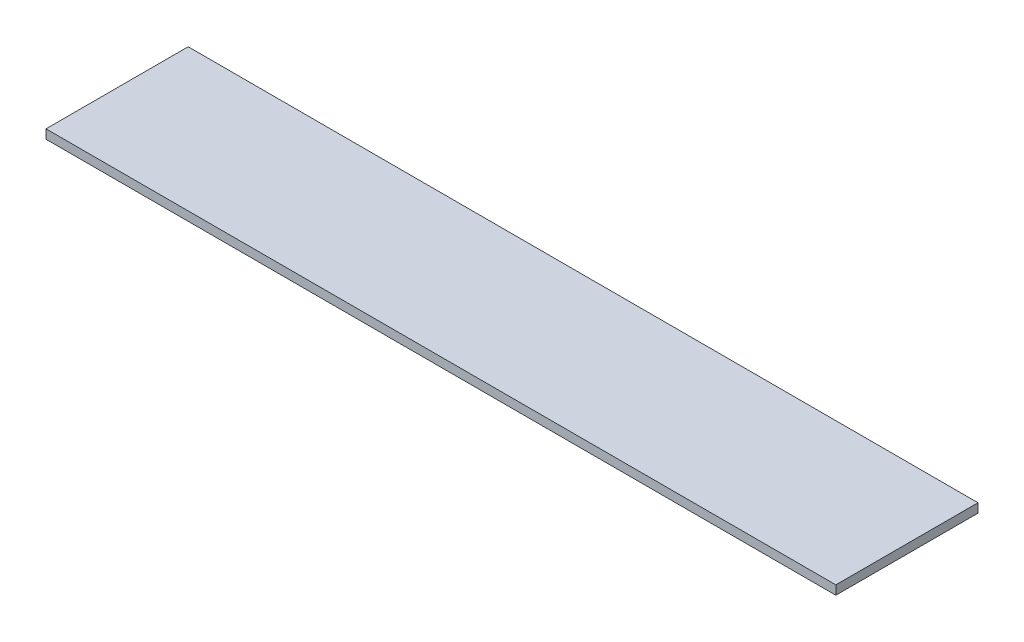
ISO-10303-21;
HEADER;
FILE_DESCRIPTION(('STEP AP214'),'2;1');
FILE_NAME('part.step','',(''),(''),'','','');
FILE_SCHEMA(('AUTOMOTIVE_DESIGN { 1 0 10303 214 1 1 1 1 }'));
ENDSEC;
DATA;
#1=APPLICATION_CONTEXT('core data for automotive mechanical design processes');
#2=APPLICATION_PROTOCOL_DEFINITION('international standard','automotive_design',2000,#1);
#3=PRODUCT_CONTEXT('',#1,'mechanical');
#4=PRODUCT('Part','Part','',(#3));
#5=PRODUCT_RELATED_PRODUCT_CATEGORY('part','',(#4));
#6=PRODUCT_DEFINITION_FORMATION('','',#4);
#7=PRODUCT_DEFINITION_CONTEXT('part definition',#1,'design');
#8=PRODUCT_DEFINITION('design','',#6,#7);
#9=PRODUCT_DEFINITION_SHAPE('','',#8);
#10=(LENGTH_UNIT() NAMED_UNIT(*) SI_UNIT(.MILLI.,.METRE.));
#11=(NAMED_UNIT(*) PLANE_ANGLE_UNIT() SI_UNIT($,.RADIAN.));
#12=(NAMED_UNIT(*) SI_UNIT($,.STERADIAN.) SOLID_ANGLE_UNIT());
#13=UNCERTAINTY_MEASURE_WITH_UNIT(LENGTH_MEASURE(1.E-05),#10,'distance_accuracy_value','');
#14=(GEOMETRIC_REPRESENTATION_CONTEXT(3) GLOBAL_UNCERTAINTY_ASSIGNED_CONTEXT((#13)) GLOBAL_UNIT_ASSIGNED_CONTEXT((#10,
#11,#12)) REPRESENTATION_CONTEXT('',''));
#15=CARTESIAN_POINT('',(0.,0.,0.));
#16=DIRECTION('',(0.,0.,1.));
#17=DIRECTION('',(1.,0.,0.));
#18=AXIS2_PLACEMENT_3D('',#15,#16,#17);
#19=CARTESIAN_POINT('',(175.,-4.,31.5));
#20=DIRECTION('',(1.,0.,0.));
#21=DIRECTION('',(0.,0.,-1.));
#22=AXIS2_PLACEMENT_3D('',#19,#20,#21);
#23=PLANE('',#22);
#24=DIRECTION('',(0.,0.,-1.));
#25=VECTOR('',#24,1.);
#26=CARTESIAN_POINT('',(175.,0.,31.5));
#27=LINE('',#26,#25);
#28=CARTESIAN_POINT('',(175.,0.,31.5));
#29=VERTEX_POINT('',#28);
#30=CARTESIAN_POINT('',(175.,0.,-31.5));
#31=VERTEX_POINT('',#30);
#32=EDGE_CURVE('E101',#29,#31,#27,.T.);
#33=ORIENTED_EDGE('',*,*,#32,.F.);
#34=DIRECTION('',(0.,1.,0.));
#35=VECTOR('',#34,1.);
#36=CARTESIAN_POINT('',(175.,-4.,31.5));
#37=LINE('',#36,#35);
#38=CARTESIAN_POINT('',(175.,-4.,31.5));
#39=VERTEX_POINT('',#38);
#40=EDGE_CURVE('E11',#39,#29,#37,.T.);
#41=ORIENTED_EDGE('',*,*,#40,.F.);
#42=DIRECTION('',(0.,0.,-1.));
#43=VECTOR('',#42,1.);
#44=CARTESIAN_POINT('',(175.,-4.,31.5));
#45=LINE('',#44,#43);
#46=CARTESIAN_POINT('',(175.,-4.,-31.5));
#47=VERTEX_POINT('',#46);
#48=EDGE_CURVE('E95',#39,#47,#45,.T.);
#49=ORIENTED_EDGE('',*,*,#48,.T.);
#50=DIRECTION('',(0.,1.,0.));
#51=VECTOR('',#50,1.);
#52=CARTESIAN_POINT('',(175.,-4.,-31.5));
#53=LINE('',#52,#51);
#54=EDGE_CURVE('E40',#47,#31,#53,.T.);
#55=ORIENTED_EDGE('',*,*,#54,.T.);
#56=EDGE_LOOP('',(#33,#41,#49,#55));
#57=FACE_BOUND('',#56,.T.);
#58=ADVANCED_FACE('F37',(#57),#23,.T.);
#59=CARTESIAN_POINT('',(-175.,-4.,31.5));
#60=DIRECTION('',(0.,0.,1.));
#61=DIRECTION('',(1.,0.,0.));
#62=AXIS2_PLACEMENT_3D('',#59,#60,#61);
#63=PLANE('',#62);
#64=DIRECTION('',(1.,0.,0.));
#65=VECTOR('',#64,1.);
#66=CARTESIAN_POINT('',(-175.,0.,31.5));
#67=LINE('',#66,#65);
#68=CARTESIAN_POINT('',(-175.,0.,31.5));
#69=VERTEX_POINT('',#68);
#70=EDGE_CURVE('E97',#69,#29,#67,.T.);
#71=ORIENTED_EDGE('',*,*,#70,.F.);
#72=DIRECTION('',(0.,1.,0.));
#73=VECTOR('',#72,1.);
#74=CARTESIAN_POINT('',(-175.,-4.,31.5));
#75=LINE('',#74,#73);
#76=CARTESIAN_POINT('',(-175.,-4.,31.5));
#77=VERTEX_POINT('',#76);
#78=EDGE_CURVE('E46',#77,#69,#75,.T.);
#79=ORIENTED_EDGE('',*,*,#78,.F.);
#80=DIRECTION('',(1.,0.,0.));
#81=VECTOR('',#80,1.);
#82=CARTESIAN_POINT('',(-175.,-4.,31.5));
#83=LINE('',#82,#81);
#84=EDGE_CURVE('E92',#77,#39,#83,.T.);
#85=ORIENTED_EDGE('',*,*,#84,.T.);
#86=ORIENTED_EDGE('',*,*,#40,.T.);
#87=EDGE_LOOP('',(#71,#79,#85,#86));
#88=FACE_BOUND('',#87,.T.);
#89=ADVANCED_FACE('F111',(#88),#63,.T.);
#90=CARTESIAN_POINT('',(-175.,-4.,31.5));
#91=DIRECTION('',(-1.,0.,0.));
#92=DIRECTION('',(0.,0.,1.));
#93=AXIS2_PLACEMENT_3D('',#90,#91,#92);
#94=PLANE('',#93);
#95=DIRECTION('',(0.,0.,1.));
#96=VECTOR('',#95,1.);
#97=CARTESIAN_POINT('',(-175.,0.,31.5));
#98=LINE('',#97,#96);
#99=CARTESIAN_POINT('',(-175.,0.,-31.5));
#100=VERTEX_POINT('',#99);
#101=EDGE_CURVE('E87',#100,#69,#98,.T.);
#102=ORIENTED_EDGE('',*,*,#101,.F.);
#103=DIRECTION('',(0.,1.,0.));
#104=VECTOR('',#103,1.);
#105=CARTESIAN_POINT('',(-175.,-4.,-31.5));
#106=LINE('',#105,#104);
#107=CARTESIAN_POINT('',(-175.,-4.,-31.5));
#108=VERTEX_POINT('',#107);
#109=EDGE_CURVE('E82',#108,#100,#106,.T.);
#110=ORIENTED_EDGE('',*,*,#109,.F.);
#111=DIRECTION('',(0.,0.,1.));
#112=VECTOR('',#111,1.);
#113=CARTESIAN_POINT('',(-175.,-4.,31.5));
#114=LINE('',#113,#112);
#115=EDGE_CURVE('E85',#108,#77,#114,.T.);
#116=ORIENTED_EDGE('',*,*,#115,.T.);
#117=ORIENTED_EDGE('',*,*,#78,.T.);
#118=EDGE_LOOP('',(#102,#110,#116,#117));
#119=FACE_BOUND('',#118,.T.);
#120=ADVANCED_FACE('F84',(#119),#94,.T.);
#121=CARTESIAN_POINT('',(-175.,-4.,-31.5));
#122=DIRECTION('',(0.,0.,-1.));
#123=DIRECTION('',(-1.,0.,0.));
#124=AXIS2_PLACEMENT_3D('',#121,#122,#123);
#125=PLANE('',#124);
#126=DIRECTION('',(-1.,0.,0.));
#127=VECTOR('',#126,1.);
#128=CARTESIAN_POINT('',(-175.,0.,-31.5));
#129=LINE('',#128,#127);
#130=EDGE_CURVE('E104',#31,#100,#129,.T.);
#131=ORIENTED_EDGE('',*,*,#130,.F.);
#132=ORIENTED_EDGE('',*,*,#54,.F.);
#133=DIRECTION('',(-1.,0.,0.));
#134=VECTOR('',#133,1.);
#135=CARTESIAN_POINT('',(-175.,-4.,-31.5));
#136=LINE('',#135,#134);
#137=EDGE_CURVE('E91',#47,#108,#136,.T.);
#138=ORIENTED_EDGE('',*,*,#137,.T.);
#139=ORIENTED_EDGE('',*,*,#109,.T.);
#140=EDGE_LOOP('',(#131,#132,#138,#139));
#141=FACE_BOUND('',#140,.T.);
#142=ADVANCED_FACE('F94',(#141),#125,.T.);
#143=CARTESIAN_POINT('',(0.,-4.,0.));
#144=DIRECTION('',(0.,-1.,0.));
#145=DIRECTION('',(0.,0.,-1.));
#146=AXIS2_PLACEMENT_3D('',#143,#144,#145);
#147=PLANE('',#146);
#148=ORIENTED_EDGE('',*,*,#48,.F.);
#149=ORIENTED_EDGE('',*,*,#84,.F.);
#150=ORIENTED_EDGE('',*,*,#115,.F.);
#151=ORIENTED_EDGE('',*,*,#137,.F.);
#152=EDGE_LOOP('',(#148,#149,#150,#151));
#153=FACE_BOUND('',#152,.T.);
#154=ADVANCED_FACE('F90',(#153),#147,.T.);
#155=CARTESIAN_POINT('',(0.,0.,0.));
#156=DIRECTION('',(0.,-1.,0.));
#157=DIRECTION('',(0.,0.,-1.));
#158=AXIS2_PLACEMENT_3D('',#155,#156,#157);
#159=PLANE('',#158);
#160=ORIENTED_EDGE('',*,*,#32,.T.);
#161=ORIENTED_EDGE('',*,*,#130,.T.);
#162=ORIENTED_EDGE('',*,*,#101,.T.);
#163=ORIENTED_EDGE('',*,*,#70,.T.);
#164=EDGE_LOOP('',(#160,#161,#162,#163));
#165=FACE_BOUND('',#164,.T.);
#166=ADVANCED_FACE('F110',(#165),#159,.F.);
#167=CLOSED_SHELL('',(#58,#89,#120,#142,#154,#166));
#168=MANIFOLD_SOLID_BREP('B2',#167);
#169=ADVANCED_BREP_SHAPE_REPRESENTATION('',(#18,#168),#14);
#170=SHAPE_DEFINITION_REPRESENTATION(#9,#169);
ENDSEC;
END-ISO-10303-21;
